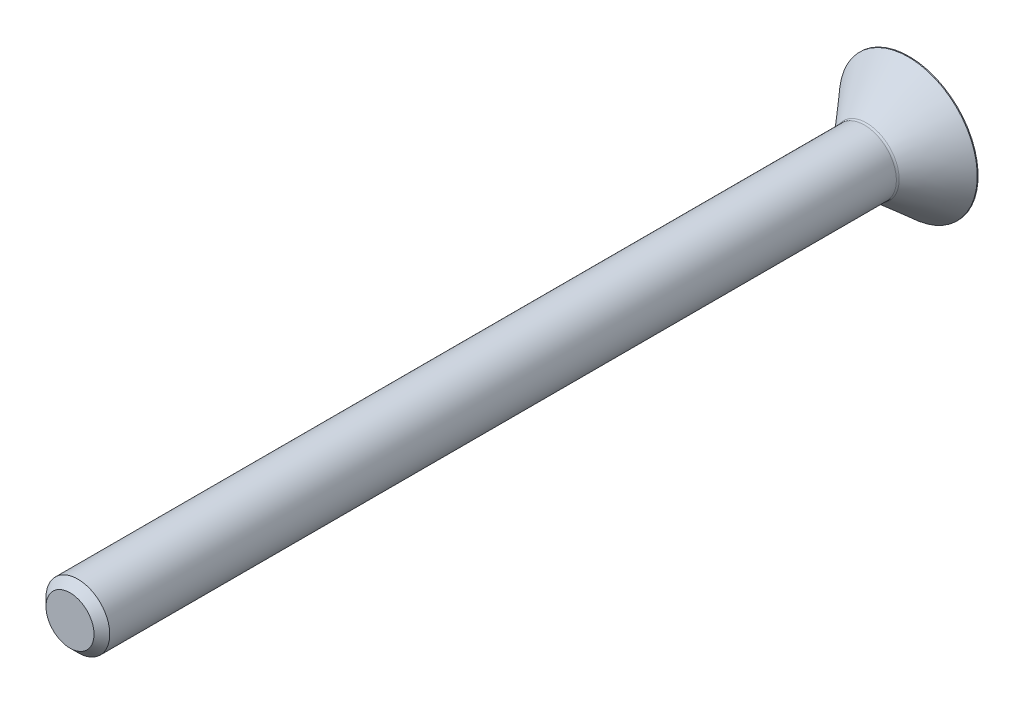
ISO-10303-21;
HEADER;
FILE_DESCRIPTION(('STEP AP214'),'2;1');
FILE_NAME('part.step','',(''),(''),'','','');
FILE_SCHEMA(('AUTOMOTIVE_DESIGN { 1 0 10303 214 1 1 1 1 }'));
ENDSEC;
DATA;
#1=APPLICATION_CONTEXT('core data for automotive mechanical design processes');
#2=APPLICATION_PROTOCOL_DEFINITION('international standard','automotive_design',2000,#1);
#3=PRODUCT_CONTEXT('',#1,'mechanical');
#4=PRODUCT('Part','Part','',(#3));
#5=PRODUCT_RELATED_PRODUCT_CATEGORY('part','',(#4));
#6=PRODUCT_DEFINITION_FORMATION('','',#4);
#7=PRODUCT_DEFINITION_CONTEXT('part definition',#1,'design');
#8=PRODUCT_DEFINITION('design','',#6,#7);
#9=PRODUCT_DEFINITION_SHAPE('','',#8);
#10=(LENGTH_UNIT() NAMED_UNIT(*) SI_UNIT(.MILLI.,.METRE.));
#11=(NAMED_UNIT(*) PLANE_ANGLE_UNIT() SI_UNIT($,.RADIAN.));
#12=(NAMED_UNIT(*) SI_UNIT($,.STERADIAN.) SOLID_ANGLE_UNIT());
#13=UNCERTAINTY_MEASURE_WITH_UNIT(LENGTH_MEASURE(1.E-05),#10,'distance_accuracy_value','');
#14=(GEOMETRIC_REPRESENTATION_CONTEXT(3) GLOBAL_UNCERTAINTY_ASSIGNED_CONTEXT((#13)) GLOBAL_UNIT_ASSIGNED_CONTEXT((#10,
#11,#12)) REPRESENTATION_CONTEXT('',''));
#15=CARTESIAN_POINT('',(0.,0.,0.));
#16=DIRECTION('',(0.,0.,1.));
#17=DIRECTION('',(1.,0.,0.));
#18=AXIS2_PLACEMENT_3D('',#15,#16,#17);
#19=CARTESIAN_POINT('',(0.,0.,-31.75));
#20=DIRECTION('',(0.,0.,-1.));
#21=DIRECTION('',(1.,0.,0.));
#22=AXIS2_PLACEMENT_3D('',#19,#20,#21);
#23=CONICAL_SURFACE('',#22,1.83308710467706,0.78539816339745);
#24=CARTESIAN_POINT('',(0.,0.,-31.75));
#25=DIRECTION('',(0.,0.,1.));
#26=DIRECTION('',(1.,0.,0.));
#27=AXIS2_PLACEMENT_3D('',#24,#25,#26);
#28=CIRCLE('',#27,1.83308710467706);
#29=CARTESIAN_POINT('',(0.,-1.83308710467706,-31.75));
#30=VERTEX_POINT('',#29);
#31=CARTESIAN_POINT('',(1.5875,-0.916543552338532,-31.75));
#32=VERTEX_POINT('',#31);
#33=EDGE_CURVE('E235',#30,#32,#28,.T.);
#34=ORIENTED_EDGE('',*,*,#33,.F.);
#35=CARTESIAN_POINT('',(1.5877,-0.916428082284693,-31.7501154809637));
#36=CARTESIAN_POINT('',(1.53312479190086,-0.947937093371809,-31.7186308083706));
#37=CARTESIAN_POINT('',(1.47763696320971,-0.979973006203394,-31.6889950460135));
#38=CARTESIAN_POINT('',(1.36449087915364,-1.04529792829092,-31.6347322600208));
#39=CARTESIAN_POINT('',(1.30682185887062,-1.07859315267522,-31.6101354351332));
#40=CARTESIAN_POINT('',(1.1905349781269,-1.14573141457583,-31.5680003642726));
#41=CARTESIAN_POINT('',(1.13194674474407,-1.17955734689075,-31.5503561927298));
#42=CARTESIAN_POINT('',(1.01348022674557,-1.24795402294714,-31.523171470085));
#43=CARTESIAN_POINT('',(0.953605562983895,-1.28252267618759,-31.5136106206951));
#44=CARTESIAN_POINT('',(0.850418771876558,-1.34209759781022,-31.504984413104));
#45=CARTESIAN_POINT('',(0.807240015952288,-1.36702686416637,-31.5037071928096));
#46=CARTESIAN_POINT('',(0.720953038535399,-1.41684467380557,-31.5058570558147));
#47=CARTESIAN_POINT('',(0.677844847078612,-1.44173319974742,-31.5092857885493));
#48=CARTESIAN_POINT('',(0.592046335002031,-1.49126899379091,-31.5206509944333));
#49=CARTESIAN_POINT('',(0.549356408925406,-1.51591603410293,-31.5285913718016));
#50=CARTESIAN_POINT('',(0.464693063478358,-1.56479643938728,-31.5485484144511));
#51=CARTESIAN_POINT('',(0.422719959755075,-1.58902962212064,-31.5605668292087));
#52=CARTESIAN_POINT('',(0.315211458113566,-1.65109968448354,-31.5962468972473));
#53=CARTESIAN_POINT('',(0.250342771708898,-1.68855163804125,-31.6225985723031));
#54=CARTESIAN_POINT('',(0.154961599380922,-1.74361998356043,-31.6670835368517));
#55=CARTESIAN_POINT('',(0.123530699536156,-1.76176662204668,-31.6827128578011));
#56=CARTESIAN_POINT('',(0.061246985569636,-1.79772614107138,-31.7153984878611));
#57=CARTESIAN_POINT('',(0.0303939039605752,-1.8155391760437,-31.732454115657));
#58=CARTESIAN_POINT('',(-0.000200000000001831,-1.8332025747309,-31.7501154809637));
#59=B_SPLINE_CURVE_WITH_KNOTS('',3,(#35,#36,#37,#38,#39,#40,#41,#42,#43,#44,#45,#46,#47,#48,#49,
#50,#51,#52,#53,#54,#55,#56,#57,#58),.UNSPECIFIED.,.F.,.F.,(4,2,2,2,2,2,2,2,2,2,2,4),(0.,
0.211482650810816,0.424197870807277,0.633533884524818,0.842342653263349,0.991755553727142,
1.14122083674205,1.29081565918877,1.44047473906438,1.6781878086972,1.79671410024894,
1.91518409436631),.UNSPECIFIED.);
#60=EDGE_CURVE('E11',#32,#30,#59,.T.);
#61=ORIENTED_EDGE('',*,*,#60,.F.);
#62=EDGE_LOOP('',(#34,#61));
#63=FACE_BOUND('',#62,.T.);
#64=ADVANCED_FACE('F41',(#63),#23,.F.);
#65=CARTESIAN_POINT('',(-1.5875,-0.91654355233853,-31.75));
#66=VERTEX_POINT('',#65);
#67=EDGE_CURVE('E233',#66,#30,#28,.T.);
#68=ORIENTED_EDGE('',*,*,#67,.F.);
#69=CARTESIAN_POINT('',(0.000200000000000431,-1.8332025747309,-31.7501154809637));
#70=CARTESIAN_POINT('',(-0.0543752080991352,-1.80169356364378,-31.7186308083706));
#71=CARTESIAN_POINT('',(-0.109863036790289,-1.7696576508122,-31.6889950460135));
#72=CARTESIAN_POINT('',(-0.223009120846358,-1.70433272872468,-31.6347322600208));
#73=CARTESIAN_POINT('',(-0.280678141129381,-1.67103750434037,-31.6101354351332));
#74=CARTESIAN_POINT('',(-0.396965021873103,-1.60389924243976,-31.5680003642726));
#75=CARTESIAN_POINT('',(-0.455553255255931,-1.57007331012484,-31.5503561927298));
#76=CARTESIAN_POINT('',(-0.574019773254431,-1.50167663406845,-31.523171470085));
#77=CARTESIAN_POINT('',(-0.633894437016105,-1.46710798082801,-31.5136106206951));
#78=CARTESIAN_POINT('',(-0.737081228123442,-1.40753305920537,-31.504984413104));
#79=CARTESIAN_POINT('',(-0.780259984047712,-1.38260379284922,-31.5037071928096));
#80=CARTESIAN_POINT('',(-0.866546961464601,-1.33278598321002,-31.5058570558147));
#81=CARTESIAN_POINT('',(-0.909655152921388,-1.30789745726817,-31.5092857885493));
#82=CARTESIAN_POINT('',(-0.995453664997969,-1.25836166322468,-31.5206509944333));
#83=CARTESIAN_POINT('',(-1.03814359107459,-1.23371462291266,-31.5285913718016));
#84=CARTESIAN_POINT('',(-1.12280693652164,-1.18483421762831,-31.5485484144511));
#85=CARTESIAN_POINT('',(-1.16478004024493,-1.16060103489495,-31.5605668292087));
#86=CARTESIAN_POINT('',(-1.27228854188643,-1.09853097253205,-31.5962468972473));
#87=CARTESIAN_POINT('',(-1.3371572282911,-1.06107901897434,-31.6225985723031));
#88=CARTESIAN_POINT('',(-1.43253840061908,-1.00601067345516,-31.6670835368517));
#89=CARTESIAN_POINT('',(-1.46396930046384,-0.987864034968913,-31.6827128578011));
#90=CARTESIAN_POINT('',(-1.52625301443036,-0.951904515944213,-31.7153984878611));
#91=CARTESIAN_POINT('',(-1.55710609603942,-0.934091480971892,-31.732454115657));
#92=CARTESIAN_POINT('',(-1.5877,-0.916428082284692,-31.7501154809637));
#93=B_SPLINE_CURVE_WITH_KNOTS('',3,(#69,#70,#71,#72,#73,#74,#75,#76,#77,#78,#79,#80,#81,#82,#83,
#84,#85,#86,#87,#88,#89,#90,#91,#92),.UNSPECIFIED.,.F.,.F.,(4,2,2,2,2,2,2,2,2,2,2,4),(0.,
0.211482650810816,0.424197870807277,0.633533884524818,0.842342653263349,0.991755553727142,
1.14122083674205,1.29081565918877,1.44047473906438,1.6781878086972,1.79671410024894,
1.91518409436632),.UNSPECIFIED.);
#94=EDGE_CURVE('E55',#30,#66,#93,.T.);
#95=ORIENTED_EDGE('',*,*,#94,.F.);
#96=EDGE_LOOP('',(#68,#95));
#97=FACE_BOUND('',#96,.T.);
#98=ADVANCED_FACE('F193',(#97),#23,.F.);
#99=CARTESIAN_POINT('',(-1.5875,0.916543552338532,-31.75));
#100=VERTEX_POINT('',#99);
#101=EDGE_CURVE('E232',#100,#66,#28,.T.);
#102=ORIENTED_EDGE('',*,*,#101,.F.);
#103=CARTESIAN_POINT('',(-1.5875,-1.84970477544497,-32.3544452553756));
#104=CARTESIAN_POINT('',(-1.5875,-1.80476240151239,-32.3203462071708));
#105=CARTESIAN_POINT('',(-1.5875,-1.75957199117801,-32.2865750198928));
#106=CARTESIAN_POINT('',(-1.5875,-1.66859358881314,-32.2198243913548));
#107=CARTESIAN_POINT('',(-1.5875,-1.62280545181692,-32.1868451478852));
#108=CARTESIAN_POINT('',(-1.5875,-1.48372199901346,-32.0888287251651));
#109=CARTESIAN_POINT('',(-1.5875,-1.38939051274161,-32.0252376365292));
#110=CARTESIAN_POINT('',(-1.5875,-1.1914395580246,-31.9001998751445));
#111=CARTESIAN_POINT('',(-1.5875,-1.08759987522282,-31.8390979424035));
#112=CARTESIAN_POINT('',(-1.5875,-0.874706489386582,-31.7271896537273));
#113=CARTESIAN_POINT('',(-1.5875,-0.76567197590225,-31.6763485632185));
#114=CARTESIAN_POINT('',(-1.5875,-0.602217292000081,-31.6141427739001));
#115=CARTESIAN_POINT('',(-1.5875,-0.550263299202898,-31.5963261951995));
#116=CARTESIAN_POINT('',(-1.5875,-0.445082037721642,-31.5648615140692));
#117=CARTESIAN_POINT('',(-1.5875,-0.391854683409841,-31.5512136928237));
#118=CARTESIAN_POINT('',(-1.5875,-0.285344657080772,-31.5290290273729));
#119=CARTESIAN_POINT('',(-1.5875,-0.23208080021017,-31.5204032745585));
#120=CARTESIAN_POINT('',(-1.5875,-0.124959456415258,-31.5084346825164));
#121=CARTESIAN_POINT('',(-1.5875,-0.0711020784671781,-31.5050908892227));
#122=CARTESIAN_POINT('',(-1.5875,0.0346213127870723,-31.5039438271109));
#123=CARTESIAN_POINT('',(-1.5875,0.0864851538798602,-31.5059346608082));
#124=CARTESIAN_POINT('',(-1.5875,0.189778917943214,-31.5148876527514));
#125=CARTESIAN_POINT('',(-1.5875,0.241208798942214,-31.5218502864056));
#126=CARTESIAN_POINT('',(-1.5875,0.344133383886249,-31.5404812853777));
#127=CARTESIAN_POINT('',(-1.5875,0.395613227208262,-31.5522304949867));
#128=CARTESIAN_POINT('',(-1.5875,0.49744523880822,-31.5798036611326));
#129=CARTESIAN_POINT('',(-1.5875,0.547797493505242,-31.5956273042326));
#130=CARTESIAN_POINT('',(-1.5875,0.705347074888852,-31.6511176410875));
#131=CARTESIAN_POINT('',(-1.5875,0.810327219424591,-31.6970631846965));
#132=CARTESIAN_POINT('',(-1.5875,1.01536433721947,-31.7992446076069));
#133=CARTESIAN_POINT('',(-1.5875,1.1154020418522,-31.8555172602774));
#134=CARTESIAN_POINT('',(-1.5875,1.30660224236785,-31.9716420088267));
#135=CARTESIAN_POINT('',(-1.5875,1.39795887507227,-32.0311784333227));
#136=CARTESIAN_POINT('',(-1.5875,1.53255412415746,-32.1232282143955));
#137=CARTESIAN_POINT('',(-1.5875,1.57683885315435,-32.1542385020961));
#138=CARTESIAN_POINT('',(-1.5875,1.66480239811795,-32.2170825224737));
#139=CARTESIAN_POINT('',(-1.5875,1.70848137749646,-32.2489160261633));
#140=CARTESIAN_POINT('',(-1.5875,1.75190803967257,-32.2810909828344));
#141=B_SPLINE_CURVE_WITH_KNOTS('',3,(#103,#104,#105,#106,#107,#108,#109,#110,#111,#112,#113,
#114,#115,#116,#117,#118,#119,#120,#121,#122,#123,#124,#125,#126,#127,#128,#129,#130,#131,#132,
#133,#134,#135,#136,#137,#138,#139,#140),.UNSPECIFIED.,.F.,.F.,(4,2,2,2,2,2,2,2,2,2,2,2,2,2,2,2,
2,2,4),(0.,0.16923836493243,0.338518567064951,0.679661123808213,1.04081978780736,
1.40073457216113,1.56536778601317,1.73001210198752,1.89164527462954,2.05324924857509,
2.20870658565539,2.36417878970806,2.52239358424591,2.68059621131738,3.0233722729095,
3.36739346781147,3.69436280662922,3.85654464660761,4.0186818490024),.UNSPECIFIED.);
#142=EDGE_CURVE('E126',#66,#100,#141,.T.);
#143=ORIENTED_EDGE('',*,*,#142,.F.);
#144=EDGE_LOOP('',(#102,#143));
#145=FACE_BOUND('',#144,.T.);
#146=ADVANCED_FACE('F198',(#145),#23,.F.);
#147=CARTESIAN_POINT('',(0.,1.83308710467706,-31.75));
#148=VERTEX_POINT('',#147);
#149=EDGE_CURVE('E141',#148,#100,#28,.T.);
#150=ORIENTED_EDGE('',*,*,#149,.F.);
#151=CARTESIAN_POINT('',(-1.5877,0.916428082284694,-31.7501154809637));
#152=CARTESIAN_POINT('',(-1.53312479190087,0.947937093371809,-31.7186308083706));
#153=CARTESIAN_POINT('',(-1.47763696320971,0.979973006203395,-31.6889950460135));
#154=CARTESIAN_POINT('',(-1.36449087915364,1.04529792829092,-31.6347322600208));
#155=CARTESIAN_POINT('',(-1.30682185887062,1.07859315267522,-31.6101354351332));
#156=CARTESIAN_POINT('',(-1.1905349781269,1.14573141457583,-31.5680003642726));
#157=CARTESIAN_POINT('',(-1.13194674474407,1.17955734689075,-31.5503561927298));
#158=CARTESIAN_POINT('',(-1.01348022674557,1.24795402294714,-31.523171470085));
#159=CARTESIAN_POINT('',(-0.953605562983896,1.28252267618759,-31.5136106206951));
#160=CARTESIAN_POINT('',(-0.850418771876559,1.34209759781022,-31.504984413104));
#161=CARTESIAN_POINT('',(-0.807240015952289,1.36702686416637,-31.5037071928096));
#162=CARTESIAN_POINT('',(-0.7209530385354,1.41684467380557,-31.5058570558147));
#163=CARTESIAN_POINT('',(-0.677844847078613,1.44173319974742,-31.5092857885493));
#164=CARTESIAN_POINT('',(-0.592046335002032,1.49126899379091,-31.5206509944333));
#165=CARTESIAN_POINT('',(-0.549356408925407,1.51591603410293,-31.5285913718016));
#166=CARTESIAN_POINT('',(-0.46469306347836,1.56479643938728,-31.5485484144511));
#167=CARTESIAN_POINT('',(-0.422719959755076,1.58902962212064,-31.5605668292087));
#168=CARTESIAN_POINT('',(-0.315211458113566,1.65109968448354,-31.5962468972473));
#169=CARTESIAN_POINT('',(-0.250342771708899,1.68855163804125,-31.6225985723031));
#170=CARTESIAN_POINT('',(-0.154961599380923,1.74361998356043,-31.6670835368517));
#171=CARTESIAN_POINT('',(-0.123530699536156,1.76176662204668,-31.6827128578011));
#172=CARTESIAN_POINT('',(-0.0612469855696365,1.79772614107138,-31.7153984878611));
#173=CARTESIAN_POINT('',(-0.0303939039605756,1.8155391760437,-31.732454115657));
#174=CARTESIAN_POINT('',(0.000200000000001483,1.8332025747309,-31.7501154809637));
#175=B_SPLINE_CURVE_WITH_KNOTS('',3,(#151,#152,#153,#154,#155,#156,#157,#158,#159,#160,#161,
#162,#163,#164,#165,#166,#167,#168,#169,#170,#171,#172,#173,#174),.UNSPECIFIED.,.F.,.F.,(4,2,2,
2,2,2,2,2,2,2,2,4),(0.,0.211482650810816,0.424197870807276,0.633533884524818,0.842342653263348,
0.991755553727142,1.14122083674205,1.29081565918877,1.44047473906438,1.6781878086972,
1.79671410024894,1.91518409436631),.UNSPECIFIED.);
#176=EDGE_CURVE('E231',#100,#148,#175,.T.);
#177=ORIENTED_EDGE('',*,*,#176,.F.);
#178=EDGE_LOOP('',(#150,#177));
#179=FACE_BOUND('',#178,.T.);
#180=ADVANCED_FACE('F212',(#179),#23,.F.);
#181=CARTESIAN_POINT('',(1.5875,0.916543552338531,-31.75));
#182=VERTEX_POINT('',#181);
#183=EDGE_CURVE('E137',#182,#148,#28,.T.);
#184=ORIENTED_EDGE('',*,*,#183,.F.);
#185=CARTESIAN_POINT('',(-0.000200000000000509,1.8332025747309,-31.7501154809637));
#186=CARTESIAN_POINT('',(0.054375208099135,1.80169356364378,-31.7186308083706));
#187=CARTESIAN_POINT('',(0.109863036790288,1.7696576508122,-31.6889950460135));
#188=CARTESIAN_POINT('',(0.223009120846358,1.70433272872468,-31.6347322600208));
#189=CARTESIAN_POINT('',(0.280678141129381,1.67103750434037,-31.6101354351332));
#190=CARTESIAN_POINT('',(0.396965021873103,1.60389924243976,-31.5680003642726));
#191=CARTESIAN_POINT('',(0.455553255255931,1.57007331012484,-31.5503561927298));
#192=CARTESIAN_POINT('',(0.574019773254431,1.50167663406845,-31.523171470085));
#193=CARTESIAN_POINT('',(0.633894437016105,1.46710798082801,-31.5136106206951));
#194=CARTESIAN_POINT('',(0.737081228123442,1.40753305920537,-31.504984413104));
#195=CARTESIAN_POINT('',(0.780259984047712,1.38260379284922,-31.5037071928096));
#196=CARTESIAN_POINT('',(0.866546961464601,1.33278598321002,-31.5058570558147));
#197=CARTESIAN_POINT('',(0.909655152921388,1.30789745726817,-31.5092857885493));
#198=CARTESIAN_POINT('',(0.995453664997969,1.25836166322469,-31.5206509944333));
#199=CARTESIAN_POINT('',(1.03814359107459,1.23371462291266,-31.5285913718016));
#200=CARTESIAN_POINT('',(1.12280693652164,1.18483421762831,-31.5485484144511));
#201=CARTESIAN_POINT('',(1.16478004024493,1.16060103489495,-31.5605668292087));
#202=CARTESIAN_POINT('',(1.27228854188643,1.09853097253205,-31.5962468972473));
#203=CARTESIAN_POINT('',(1.3371572282911,1.06107901897434,-31.6225985723031));
#204=CARTESIAN_POINT('',(1.43253840061908,1.00601067345516,-31.6670835368517));
#205=CARTESIAN_POINT('',(1.46396930046384,0.987864034968914,-31.6827128578011));
#206=CARTESIAN_POINT('',(1.52625301443036,0.951904515944214,-31.7153984878611));
#207=CARTESIAN_POINT('',(1.55710609603942,0.934091480971893,-31.732454115657));
#208=CARTESIAN_POINT('',(1.5877,0.916428082284692,-31.7501154809637));
#209=B_SPLINE_CURVE_WITH_KNOTS('',3,(#185,#186,#187,#188,#189,#190,#191,#192,#193,#194,#195,
#196,#197,#198,#199,#200,#201,#202,#203,#204,#205,#206,#207,#208),.UNSPECIFIED.,.F.,.F.,(4,2,2,
2,2,2,2,2,2,2,2,4),(0.,0.211482650810816,0.424197870807277,0.633533884524818,0.842342653263349,
0.991755553727143,1.14122083674205,1.29081565918877,1.44047473906438,1.6781878086972,
1.79671410024894,1.91518409436631),.UNSPECIFIED.);
#210=EDGE_CURVE('E167',#148,#182,#209,.T.);
#211=ORIENTED_EDGE('',*,*,#210,.F.);
#212=EDGE_LOOP('',(#184,#211));
#213=FACE_BOUND('',#212,.T.);
#214=ADVANCED_FACE('F204',(#213),#23,.F.);
#215=CARTESIAN_POINT('',(0.,0.,31.75));
#216=DIRECTION('',(0.,0.,1.));
#217=DIRECTION('',(-1.,0.,0.));
#218=AXIS2_PLACEMENT_3D('',#215,#216,#217);
#219=CYLINDRICAL_SURFACE('',#218,5.2197);
#220=CARTESIAN_POINT('',(0.,0.,-31.75));
#221=DIRECTION('',(0.,0.,-1.));
#222=DIRECTION('',(-1.,0.,0.));
#223=AXIS2_PLACEMENT_3D('',#220,#221,#222);
#224=CIRCLE('',#223,5.2197);
#225=CARTESIAN_POINT('',(-5.2197,0.,-31.75));
#226=VERTEX_POINT('',#225);
#227=EDGE_CURVE('E157',#226,#226,#224,.T.);
#228=ORIENTED_EDGE('',*,*,#227,.F.);
#229=EDGE_LOOP('',(#228));
#230=FACE_BOUND('',#229,.T.);
#231=CARTESIAN_POINT('',(0.,0.,-31.685484));
#232=DIRECTION('',(0.,0.,-1.));
#233=DIRECTION('',(-1.,0.,0.));
#234=AXIS2_PLACEMENT_3D('',#231,#232,#233);
#235=CIRCLE('',#234,5.2197);
#236=CARTESIAN_POINT('',(-5.2197,0.,-31.685484));
#237=VERTEX_POINT('',#236);
#238=EDGE_CURVE('E140',#237,#237,#235,.T.);
#239=ORIENTED_EDGE('',*,*,#238,.T.);
#240=EDGE_LOOP('',(#239));
#241=FACE_BOUND('',#240,.T.);
#242=ADVANCED_FACE('F43',(#230,#241),#219,.T.);
#243=CARTESIAN_POINT('',(0.,0.,-31.75));
#244=DIRECTION('',(0.,0.,-1.));
#245=DIRECTION('',(1.,0.,0.));
#246=AXIS2_PLACEMENT_3D('',#243,#244,#245);
#247=PLANE('',#246);
#248=ORIENTED_EDGE('',*,*,#183,.T.);
#249=ORIENTED_EDGE('',*,*,#149,.T.);
#250=ORIENTED_EDGE('',*,*,#101,.T.);
#251=ORIENTED_EDGE('',*,*,#67,.T.);
#252=ORIENTED_EDGE('',*,*,#33,.T.);
#253=EDGE_CURVE('E142',#32,#182,#28,.T.);
#254=ORIENTED_EDGE('',*,*,#253,.T.);
#255=EDGE_LOOP('',(#248,#249,#250,#251,#252,#254));
#256=FACE_BOUND('',#255,.T.);
#257=ORIENTED_EDGE('',*,*,#227,.T.);
#258=EDGE_LOOP('',(#257));
#259=FACE_BOUND('',#258,.T.);
#260=ADVANCED_FACE('F218',(#256,#259),#247,.T.);
#261=CARTESIAN_POINT('',(0.,1.81768750000001,31.75));
#262=DIRECTION('',(0.,0.,1.));
#263=DIRECTION('',(-1.,0.,0.));
#264=AXIS2_PLACEMENT_3D('',#261,#262,#263);
#265=PLANE('',#264);
#266=CARTESIAN_POINT('',(0.,0.,31.75));
#267=DIRECTION('',(0.,0.,-1.));
#268=DIRECTION('',(-1.,0.,0.));
#269=AXIS2_PLACEMENT_3D('',#266,#267,#268);
#270=CIRCLE('',#269,1.81768750000001);
#271=CARTESIAN_POINT('',(-1.81768750000001,0.,31.75));
#272=VERTEX_POINT('',#271);
#273=EDGE_CURVE('E154',#272,#272,#270,.T.);
#274=ORIENTED_EDGE('',*,*,#273,.F.);
#275=EDGE_LOOP('',(#274));
#276=FACE_BOUND('',#275,.T.);
#277=ADVANCED_FACE('F360',(#276),#265,.T.);
#278=CARTESIAN_POINT('',(0.,0.,31.75));
#279=DIRECTION('',(0.,0.,-1.));
#280=DIRECTION('',(1.,0.,0.));
#281=AXIS2_PLACEMENT_3D('',#278,#279,#280);
#282=CONICAL_SURFACE('',#281,1.81768750000001,0.785398163397453);
#283=CARTESIAN_POINT('',(0.,0.,31.1546875));
#284=DIRECTION('',(0.,0.,-1.));
#285=DIRECTION('',(-1.,0.,0.));
#286=AXIS2_PLACEMENT_3D('',#283,#284,#285);
#287=CIRCLE('',#286,2.41300000000002);
#288=CARTESIAN_POINT('',(-2.41300000000002,0.,31.1546875));
#289=VERTEX_POINT('',#288);
#290=EDGE_CURVE('E151',#289,#289,#287,.T.);
#291=ORIENTED_EDGE('',*,*,#290,.F.);
#292=EDGE_LOOP('',(#291));
#293=FACE_BOUND('',#292,.T.);
#294=ORIENTED_EDGE('',*,*,#273,.T.);
#295=EDGE_LOOP('',(#294));
#296=FACE_BOUND('',#295,.T.);
#297=ADVANCED_FACE('F350',(#293,#296),#282,.T.);
#298=CARTESIAN_POINT('',(0.,0.,31.75));
#299=DIRECTION('',(0.,0.,1.));
#300=DIRECTION('',(-1.,0.,0.));
#301=AXIS2_PLACEMENT_3D('',#298,#299,#300);
#302=CYLINDRICAL_SURFACE('',#301,2.41300000000001);
#303=CARTESIAN_POINT('',(0.,0.,-28.3673662286613));
#304=DIRECTION('',(0.,0.,-1.));
#305=DIRECTION('',(-1.,0.,0.));
#306=AXIS2_PLACEMENT_3D('',#303,#304,#305);
#307=CIRCLE('',#306,2.413);
#308=CARTESIAN_POINT('',(-2.413,0.,-28.3673662286613));
#309=VERTEX_POINT('',#308);
#310=EDGE_CURVE('E148',#309,#309,#307,.T.);
#311=ORIENTED_EDGE('',*,*,#310,.F.);
#312=EDGE_LOOP('',(#311));
#313=FACE_BOUND('',#312,.T.);
#314=ORIENTED_EDGE('',*,*,#290,.T.);
#315=EDGE_LOOP('',(#314));
#316=FACE_BOUND('',#315,.T.);
#317=ADVANCED_FACE('F340',(#313,#316),#302,.T.);
#318=CARTESIAN_POINT('',(0.,0.,-28.3673662286613));
#319=DIRECTION('',(0.,0.,1.));
#320=DIRECTION('',(-1.,0.,0.));
#321=AXIS2_PLACEMENT_3D('',#318,#319,#320);
#322=TOROIDAL_SURFACE('',#321,2.65205436006274,0.239054360062738);
#323=CARTESIAN_POINT('',(0.,0.,-28.5242));
#324=DIRECTION('',(0.,0.,-1.));
#325=DIRECTION('',(-1.,0.,0.));
#326=AXIS2_PLACEMENT_3D('',#323,#324,#325);
#327=CIRCLE('',#326,2.47163774432937);
#328=CARTESIAN_POINT('',(-2.47163774432937,0.,-28.5242));
#329=VERTEX_POINT('',#328);
#330=EDGE_CURVE('E145',#329,#329,#327,.T.);
#331=ORIENTED_EDGE('',*,*,#330,.F.);
#332=EDGE_LOOP('',(#331));
#333=FACE_BOUND('',#332,.T.);
#334=ORIENTED_EDGE('',*,*,#310,.T.);
#335=EDGE_LOOP('',(#334));
#336=FACE_BOUND('',#335,.T.);
#337=ADVANCED_FACE('F208',(#333,#336),#322,.F.);
#338=CARTESIAN_POINT('',(0.,0.,-28.5242));
#339=DIRECTION('',(0.,0.,-1.));
#340=DIRECTION('',(1.,0.,0.));
#341=AXIS2_PLACEMENT_3D('',#338,#339,#340);
#342=CONICAL_SURFACE('',#341,2.47163774432937,0.715584993317676);
#343=ORIENTED_EDGE('',*,*,#238,.F.);
#344=EDGE_LOOP('',(#343));
#345=FACE_BOUND('',#344,.T.);
#346=ORIENTED_EDGE('',*,*,#330,.T.);
#347=EDGE_LOOP('',(#346));
#348=FACE_BOUND('',#347,.T.);
#349=ADVANCED_FACE('F202',(#345,#348),#342,.T.);
#350=ORIENTED_EDGE('',*,*,#253,.F.);
#351=CARTESIAN_POINT('',(1.5875,-1.84970477544497,-32.3544452553756));
#352=CARTESIAN_POINT('',(1.5875,-1.8047624015124,-32.3203462071708));
#353=CARTESIAN_POINT('',(1.5875,-1.75957199117802,-32.2865750198928));
#354=CARTESIAN_POINT('',(1.5875,-1.66859358881315,-32.2198243913548));
#355=CARTESIAN_POINT('',(1.5875,-1.62280545181693,-32.1868451478852));
#356=CARTESIAN_POINT('',(1.5875,-1.48372199901346,-32.0888287251651));
#357=CARTESIAN_POINT('',(1.5875,-1.38939051274161,-32.0252376365292));
#358=CARTESIAN_POINT('',(1.5875,-1.1914395580246,-31.9001998751445));
#359=CARTESIAN_POINT('',(1.5875,-1.08759987522282,-31.8390979424035));
#360=CARTESIAN_POINT('',(1.5875,-0.874706489386582,-31.7271896537273));
#361=CARTESIAN_POINT('',(1.5875,-0.765671975902249,-31.6763485632185));
#362=CARTESIAN_POINT('',(1.5875,-0.60221729200008,-31.6141427739001));
#363=CARTESIAN_POINT('',(1.5875,-0.550263299202897,-31.5963261951995));
#364=CARTESIAN_POINT('',(1.5875,-0.445082037721641,-31.5648615140692));
#365=CARTESIAN_POINT('',(1.5875,-0.391854683409841,-31.5512136928237));
#366=CARTESIAN_POINT('',(1.5875,-0.285344657080771,-31.5290290273729));
#367=CARTESIAN_POINT('',(1.5875,-0.232080800210169,-31.5204032745585));
#368=CARTESIAN_POINT('',(1.5875,-0.124959456415258,-31.5084346825164));
#369=CARTESIAN_POINT('',(1.5875,-0.0711020784671783,-31.5050908892227));
#370=CARTESIAN_POINT('',(1.5875,0.034621312787072,-31.5039438271109));
#371=CARTESIAN_POINT('',(1.5875,0.0864851538798599,-31.5059346608082));
#372=CARTESIAN_POINT('',(1.5875,0.189778917943214,-31.5148876527514));
#373=CARTESIAN_POINT('',(1.5875,0.241208798942214,-31.5218502864056));
#374=CARTESIAN_POINT('',(1.5875,0.344133383886249,-31.5404812853777));
#375=CARTESIAN_POINT('',(1.5875,0.395613227208262,-31.5522304949867));
#376=CARTESIAN_POINT('',(1.5875,0.49744523880822,-31.5798036611326));
#377=CARTESIAN_POINT('',(1.5875,0.547797493505242,-31.5956273042326));
#378=CARTESIAN_POINT('',(1.5875,0.70534707488885,-31.6511176410875));
#379=CARTESIAN_POINT('',(1.5875,0.810327219424589,-31.6970631846965));
#380=CARTESIAN_POINT('',(1.5875,1.01536433721947,-31.7992446076069));
#381=CARTESIAN_POINT('',(1.5875,1.1154020418522,-31.8555172602773));
#382=CARTESIAN_POINT('',(1.5875,1.30660224236784,-31.9716420088267));
#383=CARTESIAN_POINT('',(1.5875,1.39795887507227,-32.0311784333227));
#384=CARTESIAN_POINT('',(1.5875,1.53255412415746,-32.1232282143955));
#385=CARTESIAN_POINT('',(1.5875,1.57683885315434,-32.1542385020961));
#386=CARTESIAN_POINT('',(1.5875,1.66480239811794,-32.2170825224737));
#387=CARTESIAN_POINT('',(1.5875,1.70848137749645,-32.2489160261633));
#388=CARTESIAN_POINT('',(1.5875,1.75190803967257,-32.2810909828344));
#389=B_SPLINE_CURVE_WITH_KNOTS('',3,(#351,#352,#353,#354,#355,#356,#357,#358,#359,#360,#361,
#362,#363,#364,#365,#366,#367,#368,#369,#370,#371,#372,#373,#374,#375,#376,#377,#378,#379,#380,
#381,#382,#383,#384,#385,#386,#387,#388),.UNSPECIFIED.,.F.,.F.,(4,2,2,2,2,2,2,2,2,2,2,2,2,2,2,2,
2,2,4),(0.,0.169238364932428,0.338518567064949,0.679661123808217,1.04081978780736,
1.40073457216113,1.56536778601318,1.73001210198753,1.89164527462955,2.0532492485751,
2.2087065856554,2.36417878970806,2.52239358424591,2.68059621131738,3.02337227290949,
3.36739346781147,3.69436280662922,3.85654464660761,4.01868184900241),.UNSPECIFIED.);
#390=EDGE_CURVE('E160',#182,#32,#389,.F.);
#391=ORIENTED_EDGE('',*,*,#390,.F.);
#392=EDGE_LOOP('',(#350,#391));
#393=FACE_BOUND('',#392,.T.);
#394=ADVANCED_FACE('F174',(#393),#23,.F.);
#395=CARTESIAN_POINT('',(0.,-1.83308710467706,-30.1371));
#396=DIRECTION('',(0.5,-0.866025403784439,0.));
#397=DIRECTION('',(0.866025403784439,0.5,0.));
#398=AXIS2_PLACEMENT_3D('',#395,#396,#397);
#399=PLANE('',#398);
#400=DIRECTION('',(0.,0.,-1.));
#401=VECTOR('',#400,1.);
#402=CARTESIAN_POINT('',(1.5875,-0.916543552338531,-30.1371));
#403=LINE('',#402,#401);
#404=CARTESIAN_POINT('',(1.5875,-0.916543552338531,-30.1371));
#405=VERTEX_POINT('',#404);
#406=EDGE_CURVE('E61',#405,#32,#403,.T.);
#407=ORIENTED_EDGE('',*,*,#406,.T.);
#408=ORIENTED_EDGE('',*,*,#60,.T.);
#409=DIRECTION('',(0.,0.,-1.));
#410=VECTOR('',#409,1.);
#411=CARTESIAN_POINT('',(0.,-1.83308710467706,-30.1371));
#412=LINE('',#411,#410);
#413=CARTESIAN_POINT('',(0.,-1.83308710467706,-30.1371));
#414=VERTEX_POINT('',#413);
#415=EDGE_CURVE('E92',#414,#30,#412,.T.);
#416=ORIENTED_EDGE('',*,*,#415,.F.);
#417=DIRECTION('',(0.866025403784439,0.5,0.));
#418=VECTOR('',#417,1.);
#419=CARTESIAN_POINT('',(0.,-1.83308710467706,-30.1371));
#420=LINE('',#419,#418);
#421=EDGE_CURVE('E241',#414,#405,#420,.T.);
#422=ORIENTED_EDGE('',*,*,#421,.T.);
#423=EDGE_LOOP('',(#407,#408,#416,#422));
#424=FACE_BOUND('',#423,.T.);
#425=ADVANCED_FACE('F185',(#424),#399,.F.);
#426=CARTESIAN_POINT('',(-1.5875,-0.91654355233853,-30.1371));
#427=DIRECTION('',(-0.5,-0.866025403784439,0.));
#428=DIRECTION('',(0.866025403784439,-0.5,0.));
#429=AXIS2_PLACEMENT_3D('',#426,#427,#428);
#430=PLANE('',#429);
#431=ORIENTED_EDGE('',*,*,#415,.T.);
#432=ORIENTED_EDGE('',*,*,#94,.T.);
#433=DIRECTION('',(0.,0.,-1.));
#434=VECTOR('',#433,1.);
#435=CARTESIAN_POINT('',(-1.5875,-0.91654355233853,-30.1371));
#436=LINE('',#435,#434);
#437=CARTESIAN_POINT('',(-1.5875,-0.91654355233853,-30.1371));
#438=VERTEX_POINT('',#437);
#439=EDGE_CURVE('E128',#438,#66,#436,.T.);
#440=ORIENTED_EDGE('',*,*,#439,.F.);
#441=DIRECTION('',(0.866025403784438,-0.5,0.));
#442=VECTOR('',#441,1.);
#443=CARTESIAN_POINT('',(-1.5875,-0.91654355233853,-30.1371));
#444=LINE('',#443,#442);
#445=EDGE_CURVE('E70',#438,#414,#444,.T.);
#446=ORIENTED_EDGE('',*,*,#445,.T.);
#447=EDGE_LOOP('',(#431,#432,#440,#446));
#448=FACE_BOUND('',#447,.T.);
#449=ADVANCED_FACE('F188',(#448),#430,.F.);
#450=CARTESIAN_POINT('',(-1.5875,0.916543552338532,-30.1371));
#451=DIRECTION('',(-1.,0.,0.));
#452=DIRECTION('',(0.,0.,-1.));
#453=AXIS2_PLACEMENT_3D('',#450,#451,#452);
#454=PLANE('',#453);
#455=ORIENTED_EDGE('',*,*,#439,.T.);
#456=ORIENTED_EDGE('',*,*,#142,.T.);
#457=DIRECTION('',(0.,0.,-1.));
#458=VECTOR('',#457,1.);
#459=CARTESIAN_POINT('',(-1.5875,0.916543552338532,-30.1371));
#460=LINE('',#459,#458);
#461=CARTESIAN_POINT('',(-1.5875,0.916543552338532,-30.1371));
#462=VERTEX_POINT('',#461);
#463=EDGE_CURVE('E114',#462,#100,#460,.T.);
#464=ORIENTED_EDGE('',*,*,#463,.F.);
#465=DIRECTION('',(0.,-1.,0.));
#466=VECTOR('',#465,1.);
#467=CARTESIAN_POINT('',(-1.5875,0.916543552338532,-30.1371));
#468=LINE('',#467,#466);
#469=EDGE_CURVE('E117',#462,#438,#468,.T.);
#470=ORIENTED_EDGE('',*,*,#469,.T.);
#471=EDGE_LOOP('',(#455,#456,#464,#470));
#472=FACE_BOUND('',#471,.T.);
#473=ADVANCED_FACE('F124',(#472),#454,.F.);
#474=CARTESIAN_POINT('',(0.,1.83308710467706,-30.1371));
#475=DIRECTION('',(-0.5,0.866025403784439,0.));
#476=DIRECTION('',(-0.866025403784439,-0.5,0.));
#477=AXIS2_PLACEMENT_3D('',#474,#475,#476);
#478=PLANE('',#477);
#479=ORIENTED_EDGE('',*,*,#463,.T.);
#480=ORIENTED_EDGE('',*,*,#176,.T.);
#481=DIRECTION('',(0.,0.,-1.));
#482=VECTOR('',#481,1.);
#483=CARTESIAN_POINT('',(0.,1.83308710467706,-30.1371));
#484=LINE('',#483,#482);
#485=CARTESIAN_POINT('',(0.,1.83308710467706,-30.1371));
#486=VERTEX_POINT('',#485);
#487=EDGE_CURVE('E116',#486,#148,#484,.T.);
#488=ORIENTED_EDGE('',*,*,#487,.F.);
#489=DIRECTION('',(-0.866025403784439,-0.5,0.));
#490=VECTOR('',#489,1.);
#491=CARTESIAN_POINT('',(0.,1.83308710467706,-30.1371));
#492=LINE('',#491,#490);
#493=EDGE_CURVE('E109',#486,#462,#492,.T.);
#494=ORIENTED_EDGE('',*,*,#493,.T.);
#495=EDGE_LOOP('',(#479,#480,#488,#494));
#496=FACE_BOUND('',#495,.T.);
#497=ADVANCED_FACE('F111',(#496),#478,.F.);
#498=CARTESIAN_POINT('',(1.5875,0.916543552338531,-30.1371));
#499=DIRECTION('',(0.5,0.866025403784439,0.));
#500=DIRECTION('',(-0.866025403784439,0.5,0.));
#501=AXIS2_PLACEMENT_3D('',#498,#499,#500);
#502=PLANE('',#501);
#503=ORIENTED_EDGE('',*,*,#487,.T.);
#504=ORIENTED_EDGE('',*,*,#210,.T.);
#505=DIRECTION('',(0.,0.,-1.));
#506=VECTOR('',#505,1.);
#507=CARTESIAN_POINT('',(1.5875,0.916543552338531,-30.1371));
#508=LINE('',#507,#506);
#509=CARTESIAN_POINT('',(1.5875,0.916543552338531,-30.1371));
#510=VERTEX_POINT('',#509);
#511=EDGE_CURVE('E131',#510,#182,#508,.T.);
#512=ORIENTED_EDGE('',*,*,#511,.F.);
#513=DIRECTION('',(-0.866025403784438,0.5,0.));
#514=VECTOR('',#513,1.);
#515=CARTESIAN_POINT('',(1.5875,0.916543552338531,-30.1371));
#516=LINE('',#515,#514);
#517=EDGE_CURVE('E118',#510,#486,#516,.T.);
#518=ORIENTED_EDGE('',*,*,#517,.T.);
#519=EDGE_LOOP('',(#503,#504,#512,#518));
#520=FACE_BOUND('',#519,.T.);
#521=ADVANCED_FACE('F181',(#520),#502,.F.);
#522=CARTESIAN_POINT('',(1.5875,-0.916543552338531,-30.1371));
#523=DIRECTION('',(1.,0.,0.));
#524=DIRECTION('',(0.,1.,0.));
#525=AXIS2_PLACEMENT_3D('',#522,#523,#524);
#526=PLANE('',#525);
#527=ORIENTED_EDGE('',*,*,#511,.T.);
#528=ORIENTED_EDGE('',*,*,#390,.T.);
#529=ORIENTED_EDGE('',*,*,#406,.F.);
#530=DIRECTION('',(0.,1.,0.));
#531=VECTOR('',#530,1.);
#532=CARTESIAN_POINT('',(1.5875,-0.916543552338531,-30.1371));
#533=LINE('',#532,#531);
#534=EDGE_CURVE('E100',#405,#510,#533,.T.);
#535=ORIENTED_EDGE('',*,*,#534,.T.);
#536=EDGE_LOOP('',(#527,#528,#529,#535));
#537=FACE_BOUND('',#536,.T.);
#538=ADVANCED_FACE('F178',(#537),#526,.F.);
#539=CARTESIAN_POINT('',(0.,0.,-30.1371));
#540=DIRECTION('',(0.,0.,-1.));
#541=DIRECTION('',(1.,0.,0.));
#542=AXIS2_PLACEMENT_3D('',#539,#540,#541);
#543=PLANE('',#542);
#544=ORIENTED_EDGE('',*,*,#421,.F.);
#545=ORIENTED_EDGE('',*,*,#445,.F.);
#546=ORIENTED_EDGE('',*,*,#469,.F.);
#547=ORIENTED_EDGE('',*,*,#493,.F.);
#548=ORIENTED_EDGE('',*,*,#517,.F.);
#549=ORIENTED_EDGE('',*,*,#534,.F.);
#550=EDGE_LOOP('',(#544,#545,#546,#547,#548,#549));
#551=FACE_BOUND('',#550,.T.);
#552=ADVANCED_FACE('F120',(#551),#543,.T.);
#553=CLOSED_SHELL('',(#64,#98,#146,#180,#214,#242,#260,#277,#297,#317,#337,#349,#394,#425,#449,
#473,#497,#521,#538,#552));
#554=MANIFOLD_SOLID_BREP('B2',#553);
#555=ADVANCED_BREP_SHAPE_REPRESENTATION('',(#18,#554),#14);
#556=SHAPE_DEFINITION_REPRESENTATION(#9,#555);
ENDSEC;
END-ISO-10303-21;
